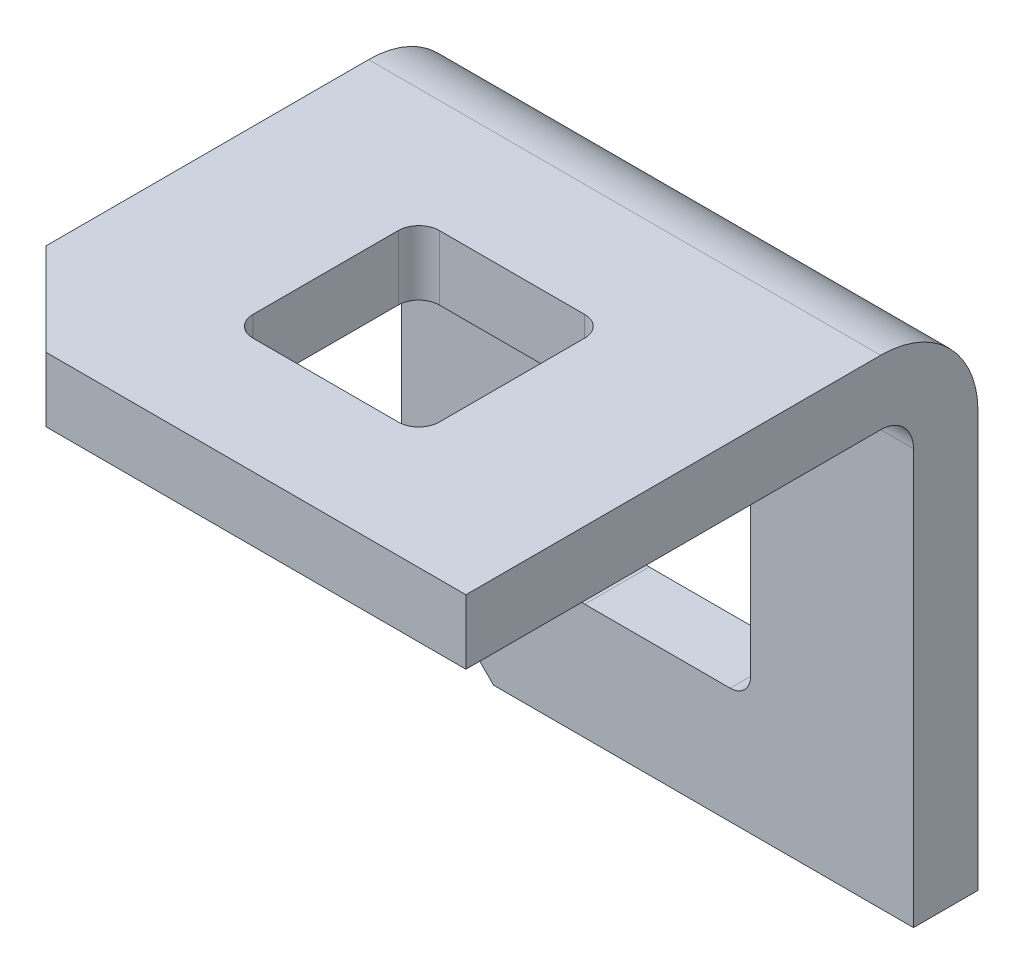
ISO-10303-21;
HEADER;
FILE_DESCRIPTION(('STEP AP214'),'2;1');
FILE_NAME('part.step','',(''),(''),'','','');
FILE_SCHEMA(('AUTOMOTIVE_DESIGN { 1 0 10303 214 1 1 1 1 }'));
ENDSEC;
DATA;
#1=APPLICATION_CONTEXT('core data for automotive mechanical design processes');
#2=APPLICATION_PROTOCOL_DEFINITION('international standard','automotive_design',2000,#1);
#3=PRODUCT_CONTEXT('',#1,'mechanical');
#4=PRODUCT('Part','Part','',(#3));
#5=PRODUCT_RELATED_PRODUCT_CATEGORY('part','',(#4));
#6=PRODUCT_DEFINITION_FORMATION('','',#4);
#7=PRODUCT_DEFINITION_CONTEXT('part definition',#1,'design');
#8=PRODUCT_DEFINITION('design','',#6,#7);
#9=PRODUCT_DEFINITION_SHAPE('','',#8);
#10=(LENGTH_UNIT() NAMED_UNIT(*) SI_UNIT(.MILLI.,.METRE.));
#11=(NAMED_UNIT(*) PLANE_ANGLE_UNIT() SI_UNIT($,.RADIAN.));
#12=(NAMED_UNIT(*) SI_UNIT($,.STERADIAN.) SOLID_ANGLE_UNIT());
#13=UNCERTAINTY_MEASURE_WITH_UNIT(LENGTH_MEASURE(1.E-05),#10,'distance_accuracy_value','');
#14=(GEOMETRIC_REPRESENTATION_CONTEXT(3) GLOBAL_UNCERTAINTY_ASSIGNED_CONTEXT((#13)) GLOBAL_UNIT_ASSIGNED_CONTEXT((#10,
#11,#12)) REPRESENTATION_CONTEXT('',''));
#15=CARTESIAN_POINT('',(0.,0.,0.));
#16=DIRECTION('',(0.,0.,1.));
#17=DIRECTION('',(1.,0.,0.));
#18=AXIS2_PLACEMENT_3D('',#15,#16,#17);
#19=CARTESIAN_POINT('',(186.750923306965,2.67609728907744,9.35787794564971));
#20=DIRECTION('',(0.,0.,-1.));
#21=DIRECTION('',(-1.,0.,0.));
#22=AXIS2_PLACEMENT_3D('',#19,#20,#21);
#23=PLANE('',#22);
#24=DIRECTION('',(0.,1.,0.));
#25=VECTOR('',#24,1.);
#26=CARTESIAN_POINT('',(-245.049076693035,2.67609728907744,9.35787794564971));
#27=LINE('',#26,#25);
#28=CARTESIAN_POINT('',(-245.049076693035,-8.42390271092249,9.35787794564971));
#29=VERTEX_POINT('',#28);
#30=CARTESIAN_POINT('',(-245.049076693035,1.86329728907745,9.35787794564971));
#31=VERTEX_POINT('',#30);
#32=EDGE_CURVE('E483',#29,#31,#27,.T.);
#33=ORIENTED_EDGE('',*,*,#32,.F.);
#34=DIRECTION('',(1.,0.,0.));
#35=VECTOR('',#34,1.);
#36=CARTESIAN_POINT('',(186.750923306965,-8.42390271092249,9.35787794564971));
#37=LINE('',#36,#35);
#38=CARTESIAN_POINT('',(-255.463076693035,-8.42390271092249,9.35787794564971));
#39=VERTEX_POINT('',#38);
#40=EDGE_CURVE('E67',#39,#29,#37,.T.);
#41=ORIENTED_EDGE('',*,*,#40,.F.);
#42=DIRECTION('',(-0.707106781186548,0.707106781186547,0.));
#43=VECTOR('',#42,1.);
#44=CARTESIAN_POINT('',(-39.9060766930353,-223.980902710922,9.35787794564895));
#45=LINE('',#44,#43);
#46=CARTESIAN_POINT('',(-257.749076693035,-6.13790271092249,9.35787794564971));
#47=VERTEX_POINT('',#46);
#48=EDGE_CURVE('E48',#39,#47,#45,.T.);
#49=ORIENTED_EDGE('',*,*,#48,.T.);
#50=DIRECTION('',(0.,-1.,0.));
#51=VECTOR('',#50,1.);
#52=CARTESIAN_POINT('',(-257.749076693035,-8.42390271092249,9.35787794564971));
#53=LINE('',#52,#51);
#54=CARTESIAN_POINT('',(-257.749076693035,1.86329728907746,9.35787794564971));
#55=VERTEX_POINT('',#54);
#56=EDGE_CURVE('E303',#55,#47,#53,.T.);
#57=ORIENTED_EDGE('',*,*,#56,.F.);
#58=DIRECTION('',(1.,0.,0.));
#59=VECTOR('',#58,1.);
#60=CARTESIAN_POINT('',(186.750923306965,1.86329728907745,9.35787794564971));
#61=LINE('',#60,#59);
#62=EDGE_CURVE('E443',#55,#31,#61,.T.);
#63=ORIENTED_EDGE('',*,*,#62,.T.);
#64=EDGE_LOOP('',(#33,#41,#49,#57,#63));
#65=FACE_BOUND('',#64,.T.);
#66=DIRECTION('',(0.,1.,0.));
#67=VECTOR('',#66,1.);
#68=CARTESIAN_POINT('',(-253.710476693035,-5.55370271092249,9.35787794564971));
#69=LINE('',#68,#67);
#70=CARTESIAN_POINT('',(-253.710476693035,-5.04570271092249,9.35787794564971));
#71=VERTEX_POINT('',#70);
#72=CARTESIAN_POINT('',(-253.710476693035,-1.43890271092256,9.35787794564971));
#73=VERTEX_POINT('',#72);
#74=EDGE_CURVE('E335',#71,#73,#69,.T.);
#75=ORIENTED_EDGE('',*,*,#74,.F.);
#76=CARTESIAN_POINT('',(-253.202476693035,-5.04570271092249,9.35787794564971));
#77=DIRECTION('',(0.,0.,1.));
#78=DIRECTION('',(0.,1.,0.));
#79=AXIS2_PLACEMENT_3D('',#76,#77,#78);
#80=CIRCLE('',#79,0.508);
#81=CARTESIAN_POINT('',(-253.202476693035,-5.55370271092249,9.35787794564971));
#82=VERTEX_POINT('',#81);
#83=EDGE_CURVE('E449',#71,#82,#80,.T.);
#84=ORIENTED_EDGE('',*,*,#83,.T.);
#85=DIRECTION('',(-1.,0.,0.));
#86=VECTOR('',#85,1.);
#87=CARTESIAN_POINT('',(-253.710476693035,-5.55370271092249,9.35787794564971));
#88=LINE('',#87,#86);
#89=CARTESIAN_POINT('',(-249.595676693035,-5.55370271092249,9.35787794564971));
#90=VERTEX_POINT('',#89);
#91=EDGE_CURVE('E336',#90,#82,#88,.T.);
#92=ORIENTED_EDGE('',*,*,#91,.F.);
#93=CARTESIAN_POINT('',(-249.595676693035,-5.04570271092249,9.35787794564971));
#94=DIRECTION('',(0.,0.,1.));
#95=DIRECTION('',(0.,1.,0.));
#96=AXIS2_PLACEMENT_3D('',#93,#94,#95);
#97=CIRCLE('',#96,0.508);
#98=CARTESIAN_POINT('',(-249.087676693035,-5.04570271092249,9.35787794564971));
#99=VERTEX_POINT('',#98);
#100=EDGE_CURVE('E248',#90,#99,#97,.T.);
#101=ORIENTED_EDGE('',*,*,#100,.T.);
#102=DIRECTION('',(0.,-1.,0.));
#103=VECTOR('',#102,1.);
#104=CARTESIAN_POINT('',(-249.087676693035,-5.55370271092249,9.35787794564971));
#105=LINE('',#104,#103);
#106=CARTESIAN_POINT('',(-249.087676693035,-1.43890271092256,9.35787794564971));
#107=VERTEX_POINT('',#106);
#108=EDGE_CURVE('E243',#107,#99,#105,.T.);
#109=ORIENTED_EDGE('',*,*,#108,.F.);
#110=CARTESIAN_POINT('',(-249.595676693035,-1.43890271092256,9.35787794564971));
#111=DIRECTION('',(0.,0.,1.));
#112=DIRECTION('',(0.,1.,0.));
#113=AXIS2_PLACEMENT_3D('',#110,#111,#112);
#114=CIRCLE('',#113,0.508);
#115=CARTESIAN_POINT('',(-249.595676693035,-0.930902710922556,9.35787794564971));
#116=VERTEX_POINT('',#115);
#117=EDGE_CURVE('E241',#107,#116,#114,.T.);
#118=ORIENTED_EDGE('',*,*,#117,.T.);
#119=DIRECTION('',(1.,0.,0.));
#120=VECTOR('',#119,1.);
#121=CARTESIAN_POINT('',(-253.710476693035,-0.930902710922556,9.35787794564971));
#122=LINE('',#121,#120);
#123=CARTESIAN_POINT('',(-253.202476693035,-0.930902710922556,9.35787794564971));
#124=VERTEX_POINT('',#123);
#125=EDGE_CURVE('E227',#124,#116,#122,.T.);
#126=ORIENTED_EDGE('',*,*,#125,.F.);
#127=CARTESIAN_POINT('',(-253.202476693035,-1.43890271092256,9.35787794564971));
#128=DIRECTION('',(0.,0.,1.));
#129=DIRECTION('',(0.,1.,0.));
#130=AXIS2_PLACEMENT_3D('',#127,#128,#129);
#131=CIRCLE('',#130,0.508);
#132=EDGE_CURVE('E249',#124,#73,#131,.T.);
#133=ORIENTED_EDGE('',*,*,#132,.T.);
#134=EDGE_LOOP('',(#75,#84,#92,#101,#109,#118,#126,#133));
#135=FACE_BOUND('',#134,.T.);
#136=ADVANCED_FACE('F38',(#65,#135),#23,.T.);
#137=CARTESIAN_POINT('',(186.750923306965,2.67609728907744,10.9578779456497));
#138=DIRECTION('',(0.,0.,-1.));
#139=DIRECTION('',(-1.,0.,0.));
#140=AXIS2_PLACEMENT_3D('',#137,#138,#139);
#141=PLANE('',#140);
#142=DIRECTION('',(1.,0.,0.));
#143=VECTOR('',#142,1.);
#144=CARTESIAN_POINT('',(186.750923306965,-8.42390271092249,10.9578779456497));
#145=LINE('',#144,#143);
#146=CARTESIAN_POINT('',(-255.463076693035,-8.42390271092249,10.9578779456497));
#147=VERTEX_POINT('',#146);
#148=CARTESIAN_POINT('',(-245.049076693035,-8.42390271092249,10.9578779456497));
#149=VERTEX_POINT('',#148);
#150=EDGE_CURVE('E337',#147,#149,#145,.T.);
#151=ORIENTED_EDGE('',*,*,#150,.T.);
#152=DIRECTION('',(0.,1.,0.));
#153=VECTOR('',#152,1.);
#154=CARTESIAN_POINT('',(-245.049076693035,2.67609728907744,10.9578779456497));
#155=LINE('',#154,#153);
#156=CARTESIAN_POINT('',(-245.049076693035,1.86329728907744,10.9578779456497));
#157=VERTEX_POINT('',#156);
#158=EDGE_CURVE('E539',#149,#157,#155,.T.);
#159=ORIENTED_EDGE('',*,*,#158,.T.);
#160=DIRECTION('',(1.,0.,0.));
#161=VECTOR('',#160,1.);
#162=CARTESIAN_POINT('',(-257.749076693035,1.86329728907744,10.9578779456497));
#163=LINE('',#162,#161);
#164=CARTESIAN_POINT('',(-257.749076693035,1.8632972890775,10.9578779456497));
#165=VERTEX_POINT('',#164);
#166=EDGE_CURVE('E456',#165,#157,#163,.T.);
#167=ORIENTED_EDGE('',*,*,#166,.F.);
#168=DIRECTION('',(0.,-1.,0.));
#169=VECTOR('',#168,1.);
#170=CARTESIAN_POINT('',(-257.749076693035,2.67609728907744,10.9578779456497));
#171=LINE('',#170,#169);
#172=CARTESIAN_POINT('',(-257.749076693035,-6.13790271092249,10.9578779456497));
#173=VERTEX_POINT('',#172);
#174=EDGE_CURVE('E268',#165,#173,#171,.T.);
#175=ORIENTED_EDGE('',*,*,#174,.T.);
#176=DIRECTION('',(0.707106781186548,-0.707106781186547,0.));
#177=VECTOR('',#176,1.);
#178=CARTESIAN_POINT('',(-257.749076693035,-6.13790271092249,10.9578779456497));
#179=LINE('',#178,#177);
#180=EDGE_CURVE('E271',#173,#147,#179,.T.);
#181=ORIENTED_EDGE('',*,*,#180,.T.);
#182=EDGE_LOOP('',(#151,#159,#167,#175,#181));
#183=FACE_BOUND('',#182,.T.);
#184=DIRECTION('',(0.,-1.,0.));
#185=VECTOR('',#184,1.);
#186=CARTESIAN_POINT('',(-249.087676693035,2.67609728907744,10.9578779456497));
#187=LINE('',#186,#185);
#188=CARTESIAN_POINT('',(-249.087676693035,-1.43890271092256,10.9578779456497));
#189=VERTEX_POINT('',#188);
#190=CARTESIAN_POINT('',(-249.087676693035,-5.04570271092258,10.9578779456497));
#191=VERTEX_POINT('',#190);
#192=EDGE_CURVE('E341',#189,#191,#187,.T.);
#193=ORIENTED_EDGE('',*,*,#192,.T.);
#194=CARTESIAN_POINT('',(-249.595676693035,-5.04570271092258,10.9578779456497));
#195=DIRECTION('',(0.,0.,-1.));
#196=DIRECTION('',(0.,1.,0.));
#197=AXIS2_PLACEMENT_3D('',#194,#195,#196);
#198=CIRCLE('',#197,0.508);
#199=CARTESIAN_POINT('',(-249.595676693035,-5.55370271092258,10.9578779456497));
#200=VERTEX_POINT('',#199);
#201=EDGE_CURVE('E372',#191,#200,#198,.T.);
#202=ORIENTED_EDGE('',*,*,#201,.T.);
#203=DIRECTION('',(-1.,0.,0.));
#204=VECTOR('',#203,1.);
#205=CARTESIAN_POINT('',(186.750923306965,-5.55370271092258,10.9578779456497));
#206=LINE('',#205,#204);
#207=CARTESIAN_POINT('',(-253.202476693035,-5.55370271092258,10.9578779456497));
#208=VERTEX_POINT('',#207);
#209=EDGE_CURVE('E376',#200,#208,#206,.T.);
#210=ORIENTED_EDGE('',*,*,#209,.T.);
#211=CARTESIAN_POINT('',(-253.202476693035,-5.04570271092258,10.9578779456497));
#212=DIRECTION('',(0.,0.,-1.));
#213=DIRECTION('',(0.,1.,0.));
#214=AXIS2_PLACEMENT_3D('',#211,#212,#213);
#215=CIRCLE('',#214,0.508);
#216=CARTESIAN_POINT('',(-253.710476693035,-5.04570271092258,10.9578779456497));
#217=VERTEX_POINT('',#216);
#218=EDGE_CURVE('E402',#208,#217,#215,.T.);
#219=ORIENTED_EDGE('',*,*,#218,.T.);
#220=DIRECTION('',(0.,1.,0.));
#221=VECTOR('',#220,1.);
#222=CARTESIAN_POINT('',(-253.710476693035,2.67609728907744,10.9578779456497));
#223=LINE('',#222,#221);
#224=CARTESIAN_POINT('',(-253.710476693035,-1.43890271092256,10.9578779456497));
#225=VERTEX_POINT('',#224);
#226=EDGE_CURVE('E296',#217,#225,#223,.T.);
#227=ORIENTED_EDGE('',*,*,#226,.T.);
#228=CARTESIAN_POINT('',(-253.202476693035,-1.43890271092256,10.9578779456497));
#229=DIRECTION('',(0.,0.,-1.));
#230=DIRECTION('',(0.,1.,0.));
#231=AXIS2_PLACEMENT_3D('',#228,#229,#230);
#232=CIRCLE('',#231,0.508);
#233=CARTESIAN_POINT('',(-253.202476693035,-0.930902710922565,10.9578779456497));
#234=VERTEX_POINT('',#233);
#235=EDGE_CURVE('E293',#225,#234,#232,.T.);
#236=ORIENTED_EDGE('',*,*,#235,.T.);
#237=DIRECTION('',(1.,0.,0.));
#238=VECTOR('',#237,1.);
#239=CARTESIAN_POINT('',(186.750923306965,-0.930902710922606,10.9578779456497));
#240=LINE('',#239,#238);
#241=CARTESIAN_POINT('',(-249.595676693035,-0.930902710922565,10.9578779456497));
#242=VERTEX_POINT('',#241);
#243=EDGE_CURVE('E297',#234,#242,#240,.T.);
#244=ORIENTED_EDGE('',*,*,#243,.T.);
#245=CARTESIAN_POINT('',(-249.595676693035,-1.43890271092256,10.9578779456497));
#246=DIRECTION('',(0.,0.,-1.));
#247=DIRECTION('',(0.,1.,0.));
#248=AXIS2_PLACEMENT_3D('',#245,#246,#247);
#249=CIRCLE('',#248,0.508);
#250=EDGE_CURVE('E252',#242,#189,#249,.T.);
#251=ORIENTED_EDGE('',*,*,#250,.T.);
#252=EDGE_LOOP('',(#193,#202,#210,#219,#227,#236,#244,#251));
#253=FACE_BOUND('',#252,.T.);
#254=ADVANCED_FACE('F556',(#183,#253),#141,.F.);
#255=CARTESIAN_POINT('',(186.750923306965,-8.42390271092249,9.35787794564971));
#256=DIRECTION('',(0.,-1.,0.));
#257=DIRECTION('',(0.,0.,-1.));
#258=AXIS2_PLACEMENT_3D('',#255,#256,#257);
#259=PLANE('',#258);
#260=DIRECTION('',(0.,0.,1.));
#261=VECTOR('',#260,1.);
#262=CARTESIAN_POINT('',(-245.049076693035,-8.42390271092249,15.0728779456497));
#263=LINE('',#262,#261);
#264=EDGE_CURVE('E546',#29,#149,#263,.T.);
#265=ORIENTED_EDGE('',*,*,#264,.T.);
#266=ORIENTED_EDGE('',*,*,#150,.F.);
#267=DIRECTION('',(0.,0.,-1.));
#268=VECTOR('',#267,1.);
#269=CARTESIAN_POINT('',(-255.463076693035,-8.42390271092249,9.35787794564971));
#270=LINE('',#269,#268);
#271=EDGE_CURVE('E306',#147,#39,#270,.T.);
#272=ORIENTED_EDGE('',*,*,#271,.T.);
#273=ORIENTED_EDGE('',*,*,#40,.T.);
#274=EDGE_LOOP('',(#265,#266,#272,#273));
#275=FACE_BOUND('',#274,.T.);
#276=ADVANCED_FACE('F551',(#275),#259,.T.);
#277=CARTESIAN_POINT('',(-257.749076693035,-8.42390271092249,9.35787794564971));
#278=DIRECTION('',(-1.,0.,0.));
#279=DIRECTION('',(0.,0.,1.));
#280=AXIS2_PLACEMENT_3D('',#277,#278,#279);
#281=PLANE('',#280);
#282=ORIENTED_EDGE('',*,*,#56,.T.);
#283=DIRECTION('',(0.,0.,1.));
#284=VECTOR('',#283,1.);
#285=CARTESIAN_POINT('',(-257.749076693035,-6.13790271092249,9.35787794564971));
#286=LINE('',#285,#284);
#287=EDGE_CURVE('E307',#47,#173,#286,.T.);
#288=ORIENTED_EDGE('',*,*,#287,.T.);
#289=ORIENTED_EDGE('',*,*,#174,.F.);
#290=DIRECTION('',(0.,0.,-1.));
#291=VECTOR('',#290,1.);
#292=CARTESIAN_POINT('',(-257.749076693035,1.86329728907745,9.35787794564971));
#293=LINE('',#292,#291);
#294=EDGE_CURVE('E394',#165,#55,#293,.T.);
#295=ORIENTED_EDGE('',*,*,#294,.T.);
#296=EDGE_LOOP('',(#282,#288,#289,#295));
#297=FACE_BOUND('',#296,.T.);
#298=ADVANCED_FACE('F565',(#297),#281,.T.);
#299=CARTESIAN_POINT('',(-253.710476693035,-5.55370271092258,11.8978779456497));
#300=DIRECTION('',(-1.,0.,0.));
#301=DIRECTION('',(0.,0.,1.));
#302=AXIS2_PLACEMENT_3D('',#299,#300,#301);
#303=PLANE('',#302);
#304=ORIENTED_EDGE('',*,*,#226,.F.);
#305=DIRECTION('',(0.,0.,-1.));
#306=VECTOR('',#305,1.);
#307=CARTESIAN_POINT('',(-253.710476693035,-5.04570271092249,9.35787794564971));
#308=LINE('',#307,#306);
#309=EDGE_CURVE('E357',#217,#71,#308,.T.);
#310=ORIENTED_EDGE('',*,*,#309,.T.);
#311=ORIENTED_EDGE('',*,*,#74,.T.);
#312=DIRECTION('',(0.,0.,1.));
#313=VECTOR('',#312,1.);
#314=CARTESIAN_POINT('',(-253.710476693035,-1.43890271092256,10.9578779456497));
#315=LINE('',#314,#313);
#316=EDGE_CURVE('E331',#73,#225,#315,.T.);
#317=ORIENTED_EDGE('',*,*,#316,.T.);
#318=EDGE_LOOP('',(#304,#310,#311,#317));
#319=FACE_BOUND('',#318,.T.);
#320=ADVANCED_FACE('F615',(#319),#303,.F.);
#321=CARTESIAN_POINT('',(-253.710476693035,-5.55370271092258,11.8978779456497));
#322=DIRECTION('',(0.,-1.,0.));
#323=DIRECTION('',(0.,0.,-1.));
#324=AXIS2_PLACEMENT_3D('',#321,#322,#323);
#325=PLANE('',#324);
#326=ORIENTED_EDGE('',*,*,#91,.T.);
#327=DIRECTION('',(0.,0.,1.));
#328=VECTOR('',#327,1.);
#329=CARTESIAN_POINT('',(-253.202476693035,-5.55370271092258,10.9578779456497));
#330=LINE('',#329,#328);
#331=EDGE_CURVE('E345',#82,#208,#330,.T.);
#332=ORIENTED_EDGE('',*,*,#331,.T.);
#333=ORIENTED_EDGE('',*,*,#209,.F.);
#334=DIRECTION('',(0.,0.,-1.));
#335=VECTOR('',#334,1.);
#336=CARTESIAN_POINT('',(-249.595676693035,-5.55370271092249,9.35787794564971));
#337=LINE('',#336,#335);
#338=EDGE_CURVE('E315',#200,#90,#337,.T.);
#339=ORIENTED_EDGE('',*,*,#338,.T.);
#340=EDGE_LOOP('',(#326,#332,#333,#339));
#341=FACE_BOUND('',#340,.T.);
#342=ADVANCED_FACE('F601',(#341),#325,.F.);
#343=CARTESIAN_POINT('',(-249.087676693035,-5.55370271092258,11.8978779456497));
#344=DIRECTION('',(1.,0.,0.));
#345=DIRECTION('',(0.,1.,0.));
#346=AXIS2_PLACEMENT_3D('',#343,#344,#345);
#347=PLANE('',#346);
#348=ORIENTED_EDGE('',*,*,#108,.T.);
#349=DIRECTION('',(0.,0.,1.));
#350=VECTOR('',#349,1.);
#351=CARTESIAN_POINT('',(-249.087676693035,-5.04570271092258,10.9578779456497));
#352=LINE('',#351,#350);
#353=EDGE_CURVE('E316',#99,#191,#352,.T.);
#354=ORIENTED_EDGE('',*,*,#353,.T.);
#355=ORIENTED_EDGE('',*,*,#192,.F.);
#356=DIRECTION('',(0.,0.,-1.));
#357=VECTOR('',#356,1.);
#358=CARTESIAN_POINT('',(-249.087676693035,-1.43890271092256,9.35787794564971));
#359=LINE('',#358,#357);
#360=EDGE_CURVE('E317',#189,#107,#359,.T.);
#361=ORIENTED_EDGE('',*,*,#360,.T.);
#362=EDGE_LOOP('',(#348,#354,#355,#361));
#363=FACE_BOUND('',#362,.T.);
#364=ADVANCED_FACE('F620',(#363),#347,.F.);
#365=CARTESIAN_POINT('',(-253.710476693035,-0.930902710922565,11.8978779456497));
#366=DIRECTION('',(0.,1.,0.));
#367=DIRECTION('',(1.,0.,0.));
#368=AXIS2_PLACEMENT_3D('',#365,#366,#367);
#369=PLANE('',#368);
#370=ORIENTED_EDGE('',*,*,#243,.F.);
#371=DIRECTION('',(0.,0.,-1.));
#372=VECTOR('',#371,1.);
#373=CARTESIAN_POINT('',(-253.202476693035,-0.930902710922556,9.35787794564971));
#374=LINE('',#373,#372);
#375=EDGE_CURVE('E234',#234,#124,#374,.T.);
#376=ORIENTED_EDGE('',*,*,#375,.T.);
#377=ORIENTED_EDGE('',*,*,#125,.T.);
#378=DIRECTION('',(0.,0.,1.));
#379=VECTOR('',#378,1.);
#380=CARTESIAN_POINT('',(-249.595676693035,-0.930902710922565,10.9578779456497));
#381=LINE('',#380,#379);
#382=EDGE_CURVE('E232',#116,#242,#381,.T.);
#383=ORIENTED_EDGE('',*,*,#382,.T.);
#384=EDGE_LOOP('',(#370,#376,#377,#383));
#385=FACE_BOUND('',#384,.T.);
#386=ADVANCED_FACE('F230',(#385),#369,.F.);
#387=CARTESIAN_POINT('',(-253.202476693035,-5.04570271092258,11.8978779456497));
#388=DIRECTION('',(0.,0.,1.));
#389=DIRECTION('',(0.,-1.,0.));
#390=AXIS2_PLACEMENT_3D('',#387,#388,#389);
#391=CYLINDRICAL_SURFACE('',#390,0.508);
#392=ORIENTED_EDGE('',*,*,#218,.F.);
#393=ORIENTED_EDGE('',*,*,#331,.F.);
#394=ORIENTED_EDGE('',*,*,#83,.F.);
#395=ORIENTED_EDGE('',*,*,#309,.F.);
#396=EDGE_LOOP('',(#392,#393,#394,#395));
#397=FACE_BOUND('',#396,.T.);
#398=ADVANCED_FACE('F612',(#397),#391,.F.);
#399=CARTESIAN_POINT('',(-253.202476693035,-1.43890271092257,11.8978779456497));
#400=DIRECTION('',(0.,0.,1.));
#401=DIRECTION('',(0.,-1.,0.));
#402=AXIS2_PLACEMENT_3D('',#399,#400,#401);
#403=CYLINDRICAL_SURFACE('',#402,0.508);
#404=ORIENTED_EDGE('',*,*,#235,.F.);
#405=ORIENTED_EDGE('',*,*,#316,.F.);
#406=ORIENTED_EDGE('',*,*,#132,.F.);
#407=ORIENTED_EDGE('',*,*,#375,.F.);
#408=EDGE_LOOP('',(#404,#405,#406,#407));
#409=FACE_BOUND('',#408,.T.);
#410=ADVANCED_FACE('F617',(#409),#403,.F.);
#411=CARTESIAN_POINT('',(-249.595676693035,-5.04570271092258,11.8978779456497));
#412=DIRECTION('',(0.,0.,1.));
#413=DIRECTION('',(0.,-1.,0.));
#414=AXIS2_PLACEMENT_3D('',#411,#412,#413);
#415=CYLINDRICAL_SURFACE('',#414,0.508);
#416=ORIENTED_EDGE('',*,*,#201,.F.);
#417=ORIENTED_EDGE('',*,*,#353,.F.);
#418=ORIENTED_EDGE('',*,*,#100,.F.);
#419=ORIENTED_EDGE('',*,*,#338,.F.);
#420=EDGE_LOOP('',(#416,#417,#418,#419));
#421=FACE_BOUND('',#420,.T.);
#422=ADVANCED_FACE('F608',(#421),#415,.F.);
#423=CARTESIAN_POINT('',(-249.595676693035,-1.43890271092257,11.8978779456497));
#424=DIRECTION('',(0.,0.,1.));
#425=DIRECTION('',(0.,-1.,0.));
#426=AXIS2_PLACEMENT_3D('',#423,#424,#425);
#427=CYLINDRICAL_SURFACE('',#426,0.508);
#428=ORIENTED_EDGE('',*,*,#250,.F.);
#429=ORIENTED_EDGE('',*,*,#382,.F.);
#430=ORIENTED_EDGE('',*,*,#117,.F.);
#431=ORIENTED_EDGE('',*,*,#360,.F.);
#432=EDGE_LOOP('',(#428,#429,#430,#431));
#433=FACE_BOUND('',#432,.T.);
#434=ADVANCED_FACE('F251',(#433),#427,.F.);
#435=CARTESIAN_POINT('',(-257.749076693035,-6.13790271092249,9.35787794564971));
#436=DIRECTION('',(0.707106781186547,0.707106781186548,0.));
#437=DIRECTION('',(0.,0.,-1.));
#438=AXIS2_PLACEMENT_3D('',#435,#436,#437);
#439=PLANE('',#438);
#440=ORIENTED_EDGE('',*,*,#48,.F.);
#441=ORIENTED_EDGE('',*,*,#271,.F.);
#442=ORIENTED_EDGE('',*,*,#180,.F.);
#443=ORIENTED_EDGE('',*,*,#287,.F.);
#444=EDGE_LOOP('',(#440,#441,#442,#443));
#445=FACE_BOUND('',#444,.T.);
#446=ADVANCED_FACE('F563',(#445),#439,.F.);
#447=CARTESIAN_POINT('',(-257.749076693035,4.27609728907751,22.0578779456497));
#448=DIRECTION('',(0.,0.,-1.));
#449=DIRECTION('',(-1.,0.,0.));
#450=AXIS2_PLACEMENT_3D('',#447,#448,#449);
#451=PLANE('',#450);
#452=DIRECTION('',(1.,0.,0.));
#453=VECTOR('',#452,1.);
#454=CARTESIAN_POINT('',(-257.749076693035,2.67609728907751,22.0578779456497));
#455=LINE('',#454,#453);
#456=CARTESIAN_POINT('',(-255.463076693035,2.67609728907751,22.0578779456497));
#457=VERTEX_POINT('',#456);
#458=CARTESIAN_POINT('',(-245.049076693035,2.67609728907751,22.0578779456497));
#459=VERTEX_POINT('',#458);
#460=EDGE_CURVE('E262',#457,#459,#455,.T.);
#461=ORIENTED_EDGE('',*,*,#460,.T.);
#462=DIRECTION('',(0.,1.,0.));
#463=VECTOR('',#462,1.);
#464=CARTESIAN_POINT('',(-245.049076693035,4.27609728907751,22.0578779456497));
#465=LINE('',#464,#463);
#466=CARTESIAN_POINT('',(-245.049076693035,4.27609728907751,22.0578779456497));
#467=VERTEX_POINT('',#466);
#468=EDGE_CURVE('E542',#459,#467,#465,.T.);
#469=ORIENTED_EDGE('',*,*,#468,.T.);
#470=DIRECTION('',(1.,0.,0.));
#471=VECTOR('',#470,1.);
#472=CARTESIAN_POINT('',(-257.749076693035,4.27609728907751,22.0578779456497));
#473=LINE('',#472,#471);
#474=CARTESIAN_POINT('',(-255.463076693035,4.27609728907751,22.0578779456497));
#475=VERTEX_POINT('',#474);
#476=EDGE_CURVE('E351',#475,#467,#473,.T.);
#477=ORIENTED_EDGE('',*,*,#476,.F.);
#478=DIRECTION('',(0.,-1.,0.));
#479=VECTOR('',#478,1.);
#480=CARTESIAN_POINT('',(-255.463076693035,4.27609728907751,22.0578779456497));
#481=LINE('',#480,#479);
#482=EDGE_CURVE('E255',#475,#457,#481,.T.);
#483=ORIENTED_EDGE('',*,*,#482,.T.);
#484=EDGE_LOOP('',(#461,#469,#477,#483));
#485=FACE_BOUND('',#484,.T.);
#486=ADVANCED_FACE('F587',(#485),#451,.F.);
#487=CARTESIAN_POINT('',(-255.463076693035,4.27609728907751,22.0578779456497));
#488=DIRECTION('',(0.707106781186548,0.,-0.707106781186548));
#489=DIRECTION('',(0.,-1.,0.));
#490=AXIS2_PLACEMENT_3D('',#487,#488,#489);
#491=PLANE('',#490);
#492=DIRECTION('',(0.707106781186548,0.,0.707106781186548));
#493=VECTOR('',#492,1.);
#494=CARTESIAN_POINT('',(-261.749676693035,4.27609728907751,15.7712779456497));
#495=LINE('',#494,#493);
#496=CARTESIAN_POINT('',(-257.749076693035,4.27609728907751,19.7718779456497));
#497=VERTEX_POINT('',#496);
#498=EDGE_CURVE('E346',#497,#475,#495,.T.);
#499=ORIENTED_EDGE('',*,*,#498,.F.);
#500=DIRECTION('',(0.,1.,0.));
#501=VECTOR('',#500,1.);
#502=CARTESIAN_POINT('',(-257.749076693035,4.27609728907751,19.7718779456497));
#503=LINE('',#502,#501);
#504=CARTESIAN_POINT('',(-257.749076693035,2.67609728907751,19.7718779456497));
#505=VERTEX_POINT('',#504);
#506=EDGE_CURVE('E312',#505,#497,#503,.T.);
#507=ORIENTED_EDGE('',*,*,#506,.F.);
#508=DIRECTION('',(-0.707106781186548,0.,-0.707106781186548));
#509=VECTOR('',#508,1.);
#510=CARTESIAN_POINT('',(-255.463076693035,2.67609728907751,22.0578779456497));
#511=LINE('',#510,#509);
#512=EDGE_CURVE('E275',#457,#505,#511,.T.);
#513=ORIENTED_EDGE('',*,*,#512,.F.);
#514=ORIENTED_EDGE('',*,*,#482,.F.);
#515=EDGE_LOOP('',(#499,#507,#513,#514));
#516=FACE_BOUND('',#515,.T.);
#517=ADVANCED_FACE('F579',(#516),#491,.F.);
#518=CARTESIAN_POINT('',(-253.202476693035,1.73609728907751,18.6796779456497));
#519=DIRECTION('',(0.,-1.,0.));
#520=DIRECTION('',(0.,0.,-1.));
#521=AXIS2_PLACEMENT_3D('',#518,#519,#520);
#522=CYLINDRICAL_SURFACE('',#521,0.508);
#523=CARTESIAN_POINT('',(-253.202476693035,2.67609728907751,18.6796779456497));
#524=DIRECTION('',(0.,1.,0.));
#525=DIRECTION('',(0.,0.,1.));
#526=AXIS2_PLACEMENT_3D('',#523,#524,#525);
#527=CIRCLE('',#526,0.508);
#528=CARTESIAN_POINT('',(-253.710476693035,2.67609728907751,18.6796779456497));
#529=VERTEX_POINT('',#528);
#530=CARTESIAN_POINT('',(-253.202476693035,2.67609728907751,19.1876779456497));
#531=VERTEX_POINT('',#530);
#532=EDGE_CURVE('E292',#529,#531,#527,.T.);
#533=ORIENTED_EDGE('',*,*,#532,.F.);
#534=DIRECTION('',(0.,-1.,0.));
#535=VECTOR('',#534,1.);
#536=CARTESIAN_POINT('',(-253.710476693035,2.67609728907751,18.6796779456497));
#537=LINE('',#536,#535);
#538=CARTESIAN_POINT('',(-253.710476693035,4.27609728907751,18.6796779456497));
#539=VERTEX_POINT('',#538);
#540=EDGE_CURVE('E299',#539,#529,#537,.T.);
#541=ORIENTED_EDGE('',*,*,#540,.F.);
#542=CARTESIAN_POINT('',(-253.202476693035,4.27609728907751,18.6796779456497));
#543=DIRECTION('',(0.,-1.,0.));
#544=DIRECTION('',(0.,0.,1.));
#545=AXIS2_PLACEMENT_3D('',#542,#543,#544);
#546=CIRCLE('',#545,0.508);
#547=CARTESIAN_POINT('',(-253.202476693035,4.27609728907751,19.1876779456497));
#548=VERTEX_POINT('',#547);
#549=EDGE_CURVE('E286',#548,#539,#546,.T.);
#550=ORIENTED_EDGE('',*,*,#549,.F.);
#551=DIRECTION('',(0.,1.,0.));
#552=VECTOR('',#551,1.);
#553=CARTESIAN_POINT('',(-253.202476693035,4.27609728907751,19.1876779456497));
#554=LINE('',#553,#552);
#555=EDGE_CURVE('E324',#531,#548,#554,.T.);
#556=ORIENTED_EDGE('',*,*,#555,.F.);
#557=EDGE_LOOP('',(#533,#541,#550,#556));
#558=FACE_BOUND('',#557,.T.);
#559=ADVANCED_FACE('F657',(#558),#522,.F.);
#560=CARTESIAN_POINT('',(-253.710476693035,1.73609728907751,19.1876779456497));
#561=DIRECTION('',(0.,0.,1.));
#562=DIRECTION('',(1.,0.,0.));
#563=AXIS2_PLACEMENT_3D('',#560,#561,#562);
#564=PLANE('',#563);
#565=DIRECTION('',(1.,0.,0.));
#566=VECTOR('',#565,1.);
#567=CARTESIAN_POINT('',(-253.710476693035,4.27609728907751,19.1876779456497));
#568=LINE('',#567,#566);
#569=CARTESIAN_POINT('',(-249.595676693035,4.27609728907751,19.1876779456497));
#570=VERTEX_POINT('',#569);
#571=EDGE_CURVE('E410',#548,#570,#568,.T.);
#572=ORIENTED_EDGE('',*,*,#571,.T.);
#573=DIRECTION('',(0.,-1.,0.));
#574=VECTOR('',#573,1.);
#575=CARTESIAN_POINT('',(-249.595676693035,2.67609728907751,19.1876779456497));
#576=LINE('',#575,#574);
#577=CARTESIAN_POINT('',(-249.595676693035,2.67609728907751,19.1876779456497));
#578=VERTEX_POINT('',#577);
#579=EDGE_CURVE('E386',#570,#578,#576,.T.);
#580=ORIENTED_EDGE('',*,*,#579,.T.);
#581=DIRECTION('',(1.,0.,0.));
#582=VECTOR('',#581,1.);
#583=CARTESIAN_POINT('',(-257.749076693035,2.67609728907751,19.1876779456497));
#584=LINE('',#583,#582);
#585=EDGE_CURVE('E352',#531,#578,#584,.T.);
#586=ORIENTED_EDGE('',*,*,#585,.F.);
#587=ORIENTED_EDGE('',*,*,#555,.T.);
#588=EDGE_LOOP('',(#572,#580,#586,#587));
#589=FACE_BOUND('',#588,.T.);
#590=ADVANCED_FACE('F649',(#589),#564,.F.);
#591=CARTESIAN_POINT('',(-249.595676693035,1.73609728907751,18.6796779456497));
#592=DIRECTION('',(0.,-1.,0.));
#593=DIRECTION('',(0.,0.,-1.));
#594=AXIS2_PLACEMENT_3D('',#591,#592,#593);
#595=CYLINDRICAL_SURFACE('',#594,0.508);
#596=CARTESIAN_POINT('',(-249.595676693035,2.67609728907751,18.6796779456497));
#597=DIRECTION('',(0.,1.,0.));
#598=DIRECTION('',(0.,0.,1.));
#599=AXIS2_PLACEMENT_3D('',#596,#597,#598);
#600=CIRCLE('',#599,0.508);
#601=CARTESIAN_POINT('',(-249.087676693035,2.67609728907751,18.6796779456497));
#602=VERTEX_POINT('',#601);
#603=EDGE_CURVE('E266',#578,#602,#600,.T.);
#604=ORIENTED_EDGE('',*,*,#603,.F.);
#605=ORIENTED_EDGE('',*,*,#579,.F.);
#606=CARTESIAN_POINT('',(-249.595676693035,4.27609728907751,18.6796779456497));
#607=DIRECTION('',(0.,-1.,0.));
#608=DIRECTION('',(0.,0.,1.));
#609=AXIS2_PLACEMENT_3D('',#606,#607,#608);
#610=CIRCLE('',#609,0.508);
#611=CARTESIAN_POINT('',(-249.087676693035,4.27609728907751,18.6796779456497));
#612=VERTEX_POINT('',#611);
#613=EDGE_CURVE('E365',#612,#570,#610,.T.);
#614=ORIENTED_EDGE('',*,*,#613,.F.);
#615=DIRECTION('',(0.,1.,0.));
#616=VECTOR('',#615,1.);
#617=CARTESIAN_POINT('',(-249.087676693035,4.27609728907751,18.6796779456497));
#618=LINE('',#617,#616);
#619=EDGE_CURVE('E320',#602,#612,#618,.T.);
#620=ORIENTED_EDGE('',*,*,#619,.F.);
#621=EDGE_LOOP('',(#604,#605,#614,#620));
#622=FACE_BOUND('',#621,.T.);
#623=ADVANCED_FACE('F646',(#622),#595,.F.);
#624=CARTESIAN_POINT('',(-249.087676693035,1.73609728907751,14.5648779456497));
#625=DIRECTION('',(1.,0.,0.));
#626=DIRECTION('',(0.,1.,0.));
#627=AXIS2_PLACEMENT_3D('',#624,#625,#626);
#628=PLANE('',#627);
#629=DIRECTION('',(0.,0.,-1.));
#630=VECTOR('',#629,1.);
#631=CARTESIAN_POINT('',(-249.087676693035,2.67609728907751,11.7706779456497));
#632=LINE('',#631,#630);
#633=CARTESIAN_POINT('',(-249.087676693035,2.67609728907751,15.0728779456497));
#634=VERTEX_POINT('',#633);
#635=EDGE_CURVE('E272',#602,#634,#632,.T.);
#636=ORIENTED_EDGE('',*,*,#635,.F.);
#637=ORIENTED_EDGE('',*,*,#619,.T.);
#638=DIRECTION('',(0.,0.,-1.));
#639=VECTOR('',#638,1.);
#640=CARTESIAN_POINT('',(-249.087676693035,4.27609728907751,14.5648779456497));
#641=LINE('',#640,#639);
#642=CARTESIAN_POINT('',(-249.087676693035,4.27609728907751,15.0728779456497));
#643=VERTEX_POINT('',#642);
#644=EDGE_CURVE('E325',#612,#643,#641,.T.);
#645=ORIENTED_EDGE('',*,*,#644,.T.);
#646=DIRECTION('',(0.,-1.,0.));
#647=VECTOR('',#646,1.);
#648=CARTESIAN_POINT('',(-249.087676693035,2.67609728907751,15.0728779456497));
#649=LINE('',#648,#647);
#650=EDGE_CURVE('E382',#643,#634,#649,.T.);
#651=ORIENTED_EDGE('',*,*,#650,.T.);
#652=EDGE_LOOP('',(#636,#637,#645,#651));
#653=FACE_BOUND('',#652,.T.);
#654=ADVANCED_FACE('F642',(#653),#628,.F.);
#655=CARTESIAN_POINT('',(-249.595676693035,1.73609728907751,15.0728779456497));
#656=DIRECTION('',(0.,-1.,0.));
#657=DIRECTION('',(0.,0.,-1.));
#658=AXIS2_PLACEMENT_3D('',#655,#656,#657);
#659=CYLINDRICAL_SURFACE('',#658,0.508);
#660=CARTESIAN_POINT('',(-249.595676693035,2.67609728907751,15.0728779456497));
#661=DIRECTION('',(0.,1.,0.));
#662=DIRECTION('',(0.,0.,1.));
#663=AXIS2_PLACEMENT_3D('',#660,#661,#662);
#664=CIRCLE('',#663,0.508);
#665=CARTESIAN_POINT('',(-249.595676693035,2.67609728907751,14.5648779456497));
#666=VERTEX_POINT('',#665);
#667=EDGE_CURVE('E276',#634,#666,#664,.T.);
#668=ORIENTED_EDGE('',*,*,#667,.F.);
#669=ORIENTED_EDGE('',*,*,#650,.F.);
#670=CARTESIAN_POINT('',(-249.595676693035,4.27609728907751,15.0728779456497));
#671=DIRECTION('',(0.,-1.,0.));
#672=DIRECTION('',(0.,0.,1.));
#673=AXIS2_PLACEMENT_3D('',#670,#671,#672);
#674=CIRCLE('',#673,0.508);
#675=CARTESIAN_POINT('',(-249.595676693035,4.27609728907751,14.5648779456497));
#676=VERTEX_POINT('',#675);
#677=EDGE_CURVE('E440',#676,#643,#674,.T.);
#678=ORIENTED_EDGE('',*,*,#677,.F.);
#679=DIRECTION('',(0.,1.,0.));
#680=VECTOR('',#679,1.);
#681=CARTESIAN_POINT('',(-249.595676693035,4.27609728907751,14.5648779456497));
#682=LINE('',#681,#680);
#683=EDGE_CURVE('E406',#666,#676,#682,.T.);
#684=ORIENTED_EDGE('',*,*,#683,.F.);
#685=EDGE_LOOP('',(#668,#669,#678,#684));
#686=FACE_BOUND('',#685,.T.);
#687=ADVANCED_FACE('F639',(#686),#659,.F.);
#688=CARTESIAN_POINT('',(-253.710476693035,1.73609728907751,14.5648779456497));
#689=DIRECTION('',(0.,0.,-1.));
#690=DIRECTION('',(-1.,0.,0.));
#691=AXIS2_PLACEMENT_3D('',#688,#689,#690);
#692=PLANE('',#691);
#693=DIRECTION('',(-1.,0.,0.));
#694=VECTOR('',#693,1.);
#695=CARTESIAN_POINT('',(-257.749076693035,2.67609728907751,14.5648779456497));
#696=LINE('',#695,#694);
#697=CARTESIAN_POINT('',(-253.202476693035,2.67609728907751,14.5648779456497));
#698=VERTEX_POINT('',#697);
#699=EDGE_CURVE('E425',#666,#698,#696,.T.);
#700=ORIENTED_EDGE('',*,*,#699,.F.);
#701=ORIENTED_EDGE('',*,*,#683,.T.);
#702=DIRECTION('',(-1.,0.,0.));
#703=VECTOR('',#702,1.);
#704=CARTESIAN_POINT('',(-253.710476693035,4.27609728907751,14.5648779456497));
#705=LINE('',#704,#703);
#706=CARTESIAN_POINT('',(-253.202476693035,4.27609728907751,14.5648779456497));
#707=VERTEX_POINT('',#706);
#708=EDGE_CURVE('E390',#676,#707,#705,.T.);
#709=ORIENTED_EDGE('',*,*,#708,.T.);
#710=DIRECTION('',(0.,-1.,0.));
#711=VECTOR('',#710,1.);
#712=CARTESIAN_POINT('',(-253.202476693035,2.67609728907751,14.5648779456497));
#713=LINE('',#712,#711);
#714=EDGE_CURVE('E281',#707,#698,#713,.T.);
#715=ORIENTED_EDGE('',*,*,#714,.T.);
#716=EDGE_LOOP('',(#700,#701,#709,#715));
#717=FACE_BOUND('',#716,.T.);
#718=ADVANCED_FACE('F637',(#717),#692,.F.);
#719=CARTESIAN_POINT('',(-253.202476693035,1.73609728907751,15.0728779456497));
#720=DIRECTION('',(0.,-1.,0.));
#721=DIRECTION('',(0.,0.,-1.));
#722=AXIS2_PLACEMENT_3D('',#719,#720,#721);
#723=CYLINDRICAL_SURFACE('',#722,0.508);
#724=CARTESIAN_POINT('',(-253.202476693035,2.67609728907751,15.0728779456497));
#725=DIRECTION('',(0.,1.,0.));
#726=DIRECTION('',(0.,0.,1.));
#727=AXIS2_PLACEMENT_3D('',#724,#725,#726);
#728=CIRCLE('',#727,0.508);
#729=CARTESIAN_POINT('',(-253.710476693035,2.67609728907751,15.0728779456497));
#730=VERTEX_POINT('',#729);
#731=EDGE_CURVE('E291',#698,#730,#728,.T.);
#732=ORIENTED_EDGE('',*,*,#731,.F.);
#733=ORIENTED_EDGE('',*,*,#714,.F.);
#734=CARTESIAN_POINT('',(-253.202476693035,4.27609728907751,15.0728779456497));
#735=DIRECTION('',(0.,-1.,0.));
#736=DIRECTION('',(0.,0.,1.));
#737=AXIS2_PLACEMENT_3D('',#734,#735,#736);
#738=CIRCLE('',#737,0.508);
#739=CARTESIAN_POINT('',(-253.710476693035,4.27609728907751,15.0728779456497));
#740=VERTEX_POINT('',#739);
#741=EDGE_CURVE('E398',#740,#707,#738,.T.);
#742=ORIENTED_EDGE('',*,*,#741,.F.);
#743=DIRECTION('',(0.,1.,0.));
#744=VECTOR('',#743,1.);
#745=CARTESIAN_POINT('',(-253.710476693035,4.27609728907751,15.0728779456497));
#746=LINE('',#745,#744);
#747=EDGE_CURVE('E277',#730,#740,#746,.T.);
#748=ORIENTED_EDGE('',*,*,#747,.F.);
#749=EDGE_LOOP('',(#732,#733,#742,#748));
#750=FACE_BOUND('',#749,.T.);
#751=ADVANCED_FACE('F660',(#750),#723,.F.);
#752=CARTESIAN_POINT('',(-253.710476693035,1.73609728907751,14.5648779456497));
#753=DIRECTION('',(-1.,0.,0.));
#754=DIRECTION('',(0.,0.,1.));
#755=AXIS2_PLACEMENT_3D('',#752,#753,#754);
#756=PLANE('',#755);
#757=DIRECTION('',(0.,0.,1.));
#758=VECTOR('',#757,1.);
#759=CARTESIAN_POINT('',(-253.710476693035,2.67609728907751,11.7706779456497));
#760=LINE('',#759,#758);
#761=EDGE_CURVE('E287',#730,#529,#760,.T.);
#762=ORIENTED_EDGE('',*,*,#761,.F.);
#763=ORIENTED_EDGE('',*,*,#747,.T.);
#764=DIRECTION('',(0.,0.,1.));
#765=VECTOR('',#764,1.);
#766=CARTESIAN_POINT('',(-253.710476693035,4.27609728907751,14.5648779456497));
#767=LINE('',#766,#765);
#768=EDGE_CURVE('E282',#740,#539,#767,.T.);
#769=ORIENTED_EDGE('',*,*,#768,.T.);
#770=ORIENTED_EDGE('',*,*,#540,.T.);
#771=EDGE_LOOP('',(#762,#763,#769,#770));
#772=FACE_BOUND('',#771,.T.);
#773=ADVANCED_FACE('F40',(#772),#756,.F.);
#774=CARTESIAN_POINT('',(-257.749076693035,4.27609728907751,11.7706779456497));
#775=DIRECTION('',(0.,1.,0.));
#776=DIRECTION('',(1.,0.,0.));
#777=AXIS2_PLACEMENT_3D('',#774,#775,#776);
#778=PLANE('',#777);
#779=DIRECTION('',(0.,0.,1.));
#780=VECTOR('',#779,1.);
#781=CARTESIAN_POINT('',(-245.049076693035,4.27609728907751,11.7706779456497));
#782=LINE('',#781,#780);
#783=CARTESIAN_POINT('',(-245.049076693035,4.27609728907751,11.7706779456497));
#784=VERTEX_POINT('',#783);
#785=EDGE_CURVE('E536',#784,#467,#782,.T.);
#786=ORIENTED_EDGE('',*,*,#785,.F.);
#787=DIRECTION('',(-1.,0.,0.));
#788=VECTOR('',#787,1.);
#789=CARTESIAN_POINT('',(-257.749076693035,4.27609728907751,11.7706779456497));
#790=LINE('',#789,#788);
#791=CARTESIAN_POINT('',(-257.749076693035,4.27609728907751,11.7706779456497));
#792=VERTEX_POINT('',#791);
#793=EDGE_CURVE('E42',#784,#792,#790,.T.);
#794=ORIENTED_EDGE('',*,*,#793,.T.);
#795=DIRECTION('',(0.,0.,1.));
#796=VECTOR('',#795,1.);
#797=CARTESIAN_POINT('',(-257.749076693035,4.27609728907751,11.7706779456497));
#798=LINE('',#797,#796);
#799=EDGE_CURVE('E350',#792,#497,#798,.T.);
#800=ORIENTED_EDGE('',*,*,#799,.T.);
#801=ORIENTED_EDGE('',*,*,#498,.T.);
#802=ORIENTED_EDGE('',*,*,#476,.T.);
#803=EDGE_LOOP('',(#786,#794,#800,#801,#802));
#804=FACE_BOUND('',#803,.T.);
#805=ORIENTED_EDGE('',*,*,#768,.F.);
#806=ORIENTED_EDGE('',*,*,#741,.T.);
#807=ORIENTED_EDGE('',*,*,#708,.F.);
#808=ORIENTED_EDGE('',*,*,#677,.T.);
#809=ORIENTED_EDGE('',*,*,#644,.F.);
#810=ORIENTED_EDGE('',*,*,#613,.T.);
#811=ORIENTED_EDGE('',*,*,#571,.F.);
#812=ORIENTED_EDGE('',*,*,#549,.T.);
#813=EDGE_LOOP('',(#805,#806,#807,#808,#809,#810,#811,#812));
#814=FACE_BOUND('',#813,.T.);
#815=ADVANCED_FACE('F589',(#804,#814),#778,.T.);
#816=CARTESIAN_POINT('',(-257.749076693035,2.67609728907751,11.7706779456497));
#817=DIRECTION('',(0.,1.,0.));
#818=DIRECTION('',(1.,0.,0.));
#819=AXIS2_PLACEMENT_3D('',#816,#817,#818);
#820=PLANE('',#819);
#821=DIRECTION('',(-1.,0.,0.));
#822=VECTOR('',#821,1.);
#823=CARTESIAN_POINT('',(-257.749076693035,2.67609728907751,11.7706779456497));
#824=LINE('',#823,#822);
#825=CARTESIAN_POINT('',(-245.049076693035,2.67609728907751,11.7706779456497));
#826=VERTEX_POINT('',#825);
#827=CARTESIAN_POINT('',(-257.749076693035,2.67609728907751,11.7706779456497));
#828=VERTEX_POINT('',#827);
#829=EDGE_CURVE('E481',#826,#828,#824,.T.);
#830=ORIENTED_EDGE('',*,*,#829,.F.);
#831=DIRECTION('',(0.,0.,1.));
#832=VECTOR('',#831,1.);
#833=CARTESIAN_POINT('',(-245.049076693035,2.67609728907751,11.7706779456497));
#834=LINE('',#833,#832);
#835=EDGE_CURVE('E55',#826,#459,#834,.T.);
#836=ORIENTED_EDGE('',*,*,#835,.T.);
#837=ORIENTED_EDGE('',*,*,#460,.F.);
#838=ORIENTED_EDGE('',*,*,#512,.T.);
#839=DIRECTION('',(0.,0.,1.));
#840=VECTOR('',#839,1.);
#841=CARTESIAN_POINT('',(-257.749076693035,2.67609728907751,11.7706779456497));
#842=LINE('',#841,#840);
#843=EDGE_CURVE('E308',#828,#505,#842,.T.);
#844=ORIENTED_EDGE('',*,*,#843,.F.);
#845=EDGE_LOOP('',(#830,#836,#837,#838,#844));
#846=FACE_BOUND('',#845,.T.);
#847=ORIENTED_EDGE('',*,*,#635,.T.);
#848=ORIENTED_EDGE('',*,*,#667,.T.);
#849=ORIENTED_EDGE('',*,*,#699,.T.);
#850=ORIENTED_EDGE('',*,*,#731,.T.);
#851=ORIENTED_EDGE('',*,*,#761,.T.);
#852=ORIENTED_EDGE('',*,*,#532,.T.);
#853=ORIENTED_EDGE('',*,*,#585,.T.);
#854=ORIENTED_EDGE('',*,*,#603,.T.);
#855=EDGE_LOOP('',(#847,#848,#849,#850,#851,#852,#853,#854));
#856=FACE_BOUND('',#855,.T.);
#857=ADVANCED_FACE('F583',(#846,#856),#820,.F.);
#858=CARTESIAN_POINT('',(-257.749076693035,4.27609728907751,11.7706779456497));
#859=DIRECTION('',(1.,0.,0.));
#860=DIRECTION('',(0.,1.,0.));
#861=AXIS2_PLACEMENT_3D('',#858,#859,#860);
#862=PLANE('',#861);
#863=ORIENTED_EDGE('',*,*,#843,.T.);
#864=ORIENTED_EDGE('',*,*,#506,.T.);
#865=ORIENTED_EDGE('',*,*,#799,.F.);
#866=DIRECTION('',(0.,-1.,0.));
#867=VECTOR('',#866,1.);
#868=CARTESIAN_POINT('',(-257.749076693035,4.27609728907751,11.7706779456497));
#869=LINE('',#868,#867);
#870=EDGE_CURVE('E326',#792,#828,#869,.T.);
#871=ORIENTED_EDGE('',*,*,#870,.T.);
#872=EDGE_LOOP('',(#863,#864,#865,#871));
#873=FACE_BOUND('',#872,.T.);
#874=ADVANCED_FACE('F514',(#873),#862,.F.);
#875=CARTESIAN_POINT('',(-257.749076693035,1.86329728907751,11.7706779456497));
#876=DIRECTION('',(-1.,0.,0.));
#877=DIRECTION('',(0.,0.,1.));
#878=AXIS2_PLACEMENT_3D('',#875,#876,#877);
#879=PLANE('',#878);
#880=CARTESIAN_POINT('',(-257.749076693035,1.86329728907751,11.7706779456497));
#881=DIRECTION('',(1.,0.,0.));
#882=DIRECTION('',(0.,0.,1.));
#883=AXIS2_PLACEMENT_3D('',#880,#881,#882);
#884=CIRCLE('',#883,0.8128);
#885=EDGE_CURVE('E330',#165,#828,#884,.T.);
#886=ORIENTED_EDGE('',*,*,#885,.T.);
#887=ORIENTED_EDGE('',*,*,#870,.F.);
#888=CARTESIAN_POINT('',(-257.749076693035,1.86329728907751,11.7706779456497));
#889=DIRECTION('',(1.,0.,0.));
#890=DIRECTION('',(0.,0.,-1.));
#891=AXIS2_PLACEMENT_3D('',#888,#889,#890);
#892=CIRCLE('',#891,2.4128);
#893=EDGE_CURVE('E371',#55,#792,#892,.T.);
#894=ORIENTED_EDGE('',*,*,#893,.F.);
#895=ORIENTED_EDGE('',*,*,#294,.F.);
#896=EDGE_LOOP('',(#886,#887,#894,#895));
#897=FACE_BOUND('',#896,.T.);
#898=ADVANCED_FACE('F507',(#897),#879,.T.);
#899=CARTESIAN_POINT('',(-164.11306230917,1.86329728907751,11.7706779456497));
#900=DIRECTION('',(-1.,0.,0.));
#901=DIRECTION('',(0.,0.,1.));
#902=AXIS2_PLACEMENT_3D('',#899,#900,#901);
#903=CYLINDRICAL_SURFACE('',#902,2.4128);
#904=CARTESIAN_POINT('',(-245.049076693035,1.86329728907751,11.7706779456497));
#905=DIRECTION('',(-1.,0.,0.));
#906=DIRECTION('',(0.,0.,1.));
#907=AXIS2_PLACEMENT_3D('',#904,#905,#906);
#908=CIRCLE('',#907,2.4128);
#909=EDGE_CURVE('E503',#31,#784,#908,.F.);
#910=ORIENTED_EDGE('',*,*,#909,.F.);
#911=ORIENTED_EDGE('',*,*,#62,.F.);
#912=ORIENTED_EDGE('',*,*,#893,.T.);
#913=ORIENTED_EDGE('',*,*,#793,.F.);
#914=EDGE_LOOP('',(#910,#911,#912,#913));
#915=FACE_BOUND('',#914,.T.);
#916=ADVANCED_FACE('F500',(#915),#903,.T.);
#917=CARTESIAN_POINT('',(-164.11306230917,1.86329728907751,11.7706779456497));
#918=DIRECTION('',(-1.,0.,0.));
#919=DIRECTION('',(0.,0.,1.));
#920=AXIS2_PLACEMENT_3D('',#917,#918,#919);
#921=CYLINDRICAL_SURFACE('',#920,0.8128);
#922=ORIENTED_EDGE('',*,*,#166,.T.);
#923=CARTESIAN_POINT('',(-245.049076693035,1.86329728907751,11.7706779456497));
#924=DIRECTION('',(-1.,0.,0.));
#925=DIRECTION('',(0.,0.,1.));
#926=AXIS2_PLACEMENT_3D('',#923,#924,#925);
#927=CIRCLE('',#926,0.8128);
#928=EDGE_CURVE('E11',#157,#826,#927,.F.);
#929=ORIENTED_EDGE('',*,*,#928,.T.);
#930=ORIENTED_EDGE('',*,*,#829,.T.);
#931=ORIENTED_EDGE('',*,*,#885,.F.);
#932=EDGE_LOOP('',(#922,#929,#930,#931));
#933=FACE_BOUND('',#932,.T.);
#934=ADVANCED_FACE('F666',(#933),#921,.F.);
#935=CARTESIAN_POINT('',(-245.049076693035,-8.42390271092249,15.0728779456497));
#936=DIRECTION('',(-1.,0.,0.));
#937=DIRECTION('',(0.,0.,1.));
#938=AXIS2_PLACEMENT_3D('',#935,#936,#937);
#939=PLANE('',#938);
#940=ORIENTED_EDGE('',*,*,#32,.T.);
#941=ORIENTED_EDGE('',*,*,#909,.T.);
#942=ORIENTED_EDGE('',*,*,#785,.T.);
#943=ORIENTED_EDGE('',*,*,#468,.F.);
#944=ORIENTED_EDGE('',*,*,#835,.F.);
#945=ORIENTED_EDGE('',*,*,#928,.F.);
#946=ORIENTED_EDGE('',*,*,#158,.F.);
#947=ORIENTED_EDGE('',*,*,#264,.F.);
#948=EDGE_LOOP('',(#940,#941,#942,#943,#944,#945,#946,#947));
#949=FACE_BOUND('',#948,.T.);
#950=ADVANCED_FACE('F672',(#949),#939,.F.);
#951=CLOSED_SHELL('',(#136,#254,#276,#298,#320,#342,#364,#386,#398,#410,#422,#434,#446,#486,
#517,#559,#590,#623,#654,#687,#718,#751,#773,#815,#857,#874,#898,#916,#934,#950));
#952=MANIFOLD_SOLID_BREP('B2',#951);
#953=ADVANCED_BREP_SHAPE_REPRESENTATION('',(#18,#952),#14);
#954=SHAPE_DEFINITION_REPRESENTATION(#9,#953);
ENDSEC;
END-ISO-10303-21;
